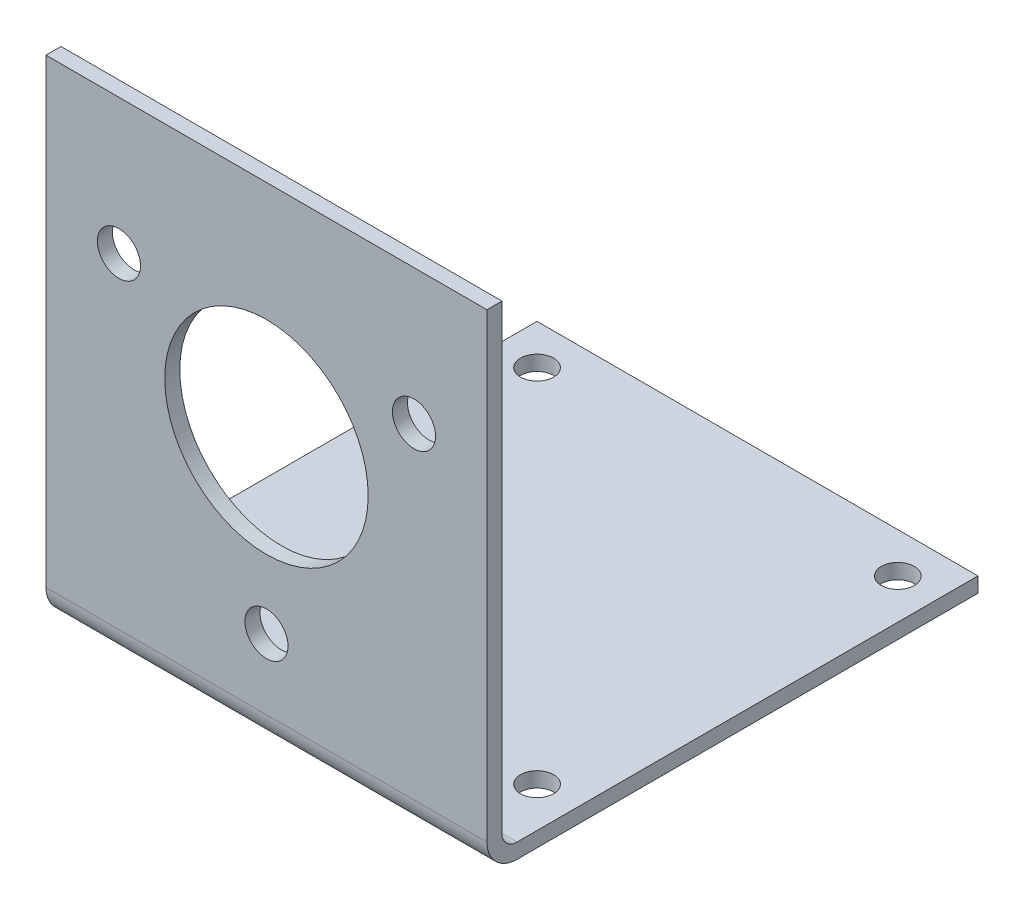
ISO-10303-21;
HEADER;
FILE_DESCRIPTION(('STEP AP214'),'2;1');
FILE_NAME('part.step','',(''),(''),'','','');
FILE_SCHEMA(('AUTOMOTIVE_DESIGN { 1 0 10303 214 1 1 1 1 }'));
ENDSEC;
DATA;
#1=APPLICATION_CONTEXT('core data for automotive mechanical design processes');
#2=APPLICATION_PROTOCOL_DEFINITION('international standard','automotive_design',2000,#1);
#3=PRODUCT_CONTEXT('',#1,'mechanical');
#4=PRODUCT('Part','Part','',(#3));
#5=PRODUCT_RELATED_PRODUCT_CATEGORY('part','',(#4));
#6=PRODUCT_DEFINITION_FORMATION('','',#4);
#7=PRODUCT_DEFINITION_CONTEXT('part definition',#1,'design');
#8=PRODUCT_DEFINITION('design','',#6,#7);
#9=PRODUCT_DEFINITION_SHAPE('','',#8);
#10=(LENGTH_UNIT() NAMED_UNIT(*) SI_UNIT(.MILLI.,.METRE.));
#11=(NAMED_UNIT(*) PLANE_ANGLE_UNIT() SI_UNIT($,.RADIAN.));
#12=(NAMED_UNIT(*) SI_UNIT($,.STERADIAN.) SOLID_ANGLE_UNIT());
#13=UNCERTAINTY_MEASURE_WITH_UNIT(LENGTH_MEASURE(1.E-05),#10,'distance_accuracy_value','');
#14=(GEOMETRIC_REPRESENTATION_CONTEXT(3) GLOBAL_UNCERTAINTY_ASSIGNED_CONTEXT((#13)) GLOBAL_UNIT_ASSIGNED_CONTEXT((#10,
#11,#12)) REPRESENTATION_CONTEXT('',''));
#15=CARTESIAN_POINT('',(0.,0.,0.));
#16=DIRECTION('',(0.,0.,1.));
#17=DIRECTION('',(1.,0.,0.));
#18=AXIS2_PLACEMENT_3D('',#15,#16,#17);
#19=CARTESIAN_POINT('',(-22.,24.3035399670615,-1.5));
#20=DIRECTION('',(0.,0.,-1.));
#21=DIRECTION('',(0.,1.,0.));
#22=AXIS2_PLACEMENT_3D('',#19,#20,#21);
#23=PLANE('',#22);
#24=CARTESIAN_POINT('',(-22.,9.99999999999999,-1.5));
#25=DIRECTION('',(0.,0.,1.));
#26=DIRECTION('',(0.,-1.,0.));
#27=AXIS2_PLACEMENT_3D('',#24,#25,#26);
#28=CIRCLE('',#27,2.15);
#29=CARTESIAN_POINT('',(-22.,7.85,-1.5));
#30=VERTEX_POINT('',#29);
#31=EDGE_CURVE('E98',#30,#30,#28,.T.);
#32=ORIENTED_EDGE('',*,*,#31,.T.);
#33=EDGE_LOOP('',(#32));
#34=FACE_BOUND('',#33,.T.);
#35=CARTESIAN_POINT('',(-22.,27.,-1.5));
#36=DIRECTION('',(0.,0.,-1.));
#37=DIRECTION('',(-1.,0.,0.));
#38=AXIS2_PLACEMENT_3D('',#35,#36,#37);
#39=CIRCLE('',#38,10.15);
#40=CARTESIAN_POINT('',(-32.15,27.,-1.5));
#41=VERTEX_POINT('',#40);
#42=EDGE_CURVE('E158',#41,#41,#39,.F.);
#43=ORIENTED_EDGE('',*,*,#42,.T.);
#44=EDGE_LOOP('',(#43));
#45=FACE_BOUND('',#44,.T.);
#46=CARTESIAN_POINT('',(-36.7224318643355,35.5,-1.5));
#47=DIRECTION('',(0.,0.,1.));
#48=DIRECTION('',(1.,0.,0.));
#49=AXIS2_PLACEMENT_3D('',#46,#47,#48);
#50=CIRCLE('',#49,2.15);
#51=CARTESIAN_POINT('',(-34.5724318643355,35.5,-1.5));
#52=VERTEX_POINT('',#51);
#53=EDGE_CURVE('E160',#52,#52,#50,.T.);
#54=ORIENTED_EDGE('',*,*,#53,.T.);
#55=EDGE_LOOP('',(#54));
#56=FACE_BOUND('',#55,.T.);
#57=CARTESIAN_POINT('',(-7.27756813566455,35.5,-1.5));
#58=DIRECTION('',(0.,0.,1.));
#59=DIRECTION('',(0.,-1.,0.));
#60=AXIS2_PLACEMENT_3D('',#57,#58,#59);
#61=CIRCLE('',#60,2.15);
#62=CARTESIAN_POINT('',(-7.27756813566455,33.35,-1.5));
#63=VERTEX_POINT('',#62);
#64=EDGE_CURVE('E20',#63,#63,#61,.T.);
#65=ORIENTED_EDGE('',*,*,#64,.T.);
#66=EDGE_LOOP('',(#65));
#67=FACE_BOUND('',#66,.T.);
#68=DIRECTION('',(1.,0.,0.));
#69=VECTOR('',#68,1.);
#70=CARTESIAN_POINT('',(0.,49.,-1.5));
#71=LINE('',#70,#69);
#72=CARTESIAN_POINT('',(0.,49.,-1.5));
#73=VERTEX_POINT('',#72);
#74=CARTESIAN_POINT('',(-44.,49.,-1.5));
#75=VERTEX_POINT('',#74);
#76=EDGE_CURVE('E104',#73,#75,#71,.F.);
#77=ORIENTED_EDGE('',*,*,#76,.F.);
#78=DIRECTION('',(0.,1.,0.));
#79=VECTOR('',#78,1.);
#80=CARTESIAN_POINT('',(0.,3.,-1.5));
#81=LINE('',#80,#79);
#82=CARTESIAN_POINT('',(0.,3.,-1.5));
#83=VERTEX_POINT('',#82);
#84=EDGE_CURVE('E95',#83,#73,#81,.T.);
#85=ORIENTED_EDGE('',*,*,#84,.F.);
#86=DIRECTION('',(-1.,0.,0.));
#87=VECTOR('',#86,1.);
#88=CARTESIAN_POINT('',(-22.,3.,-1.5));
#89=LINE('',#88,#87);
#90=CARTESIAN_POINT('',(-44.,3.,-1.5));
#91=VERTEX_POINT('',#90);
#92=EDGE_CURVE('E83',#83,#91,#89,.T.);
#93=ORIENTED_EDGE('',*,*,#92,.T.);
#94=DIRECTION('',(0.,-1.,0.));
#95=VECTOR('',#94,1.);
#96=CARTESIAN_POINT('',(-44.,3.,-1.5));
#97=LINE('',#96,#95);
#98=EDGE_CURVE('E92',#75,#91,#97,.T.);
#99=ORIENTED_EDGE('',*,*,#98,.F.);
#100=EDGE_LOOP('',(#77,#85,#93,#99));
#101=FACE_BOUND('',#100,.T.);
#102=ADVANCED_FACE('F17',(#34,#45,#56,#67,#101),#23,.T.);
#103=CARTESIAN_POINT('',(0.,49.,0.));
#104=DIRECTION('',(0.,1.,0.));
#105=DIRECTION('',(0.,0.,1.));
#106=AXIS2_PLACEMENT_3D('',#103,#104,#105);
#107=PLANE('',#106);
#108=DIRECTION('',(1.,0.,0.));
#109=VECTOR('',#108,1.);
#110=CARTESIAN_POINT('',(-22.,49.,0.));
#111=LINE('',#110,#109);
#112=CARTESIAN_POINT('',(-44.,49.,0.));
#113=VERTEX_POINT('',#112);
#114=CARTESIAN_POINT('',(0.,49.,0.));
#115=VERTEX_POINT('',#114);
#116=EDGE_CURVE('E177',#113,#115,#111,.T.);
#117=ORIENTED_EDGE('',*,*,#116,.T.);
#118=DIRECTION('',(0.,0.,1.));
#119=VECTOR('',#118,1.);
#120=CARTESIAN_POINT('',(0.,49.,0.));
#121=LINE('',#120,#119);
#122=EDGE_CURVE('E165',#73,#115,#121,.T.);
#123=ORIENTED_EDGE('',*,*,#122,.F.);
#124=ORIENTED_EDGE('',*,*,#76,.T.);
#125=DIRECTION('',(0.,0.,1.));
#126=VECTOR('',#125,1.);
#127=CARTESIAN_POINT('',(-44.,49.,0.));
#128=LINE('',#127,#126);
#129=EDGE_CURVE('E102',#75,#113,#128,.T.);
#130=ORIENTED_EDGE('',*,*,#129,.T.);
#131=EDGE_LOOP('',(#117,#123,#124,#130));
#132=FACE_BOUND('',#131,.T.);
#133=ADVANCED_FACE('F187',(#132),#107,.T.);
#134=CARTESIAN_POINT('',(-7.27756813566455,35.5,-82.0853214649246));
#135=DIRECTION('',(0.,0.,1.));
#136=DIRECTION('',(0.,-1.,0.));
#137=AXIS2_PLACEMENT_3D('',#134,#135,#136);
#138=CYLINDRICAL_SURFACE('',#137,2.15);
#139=CARTESIAN_POINT('',(-7.27756813566455,35.5,0.));
#140=DIRECTION('',(0.,0.,1.));
#141=DIRECTION('',(0.,-1.,0.));
#142=AXIS2_PLACEMENT_3D('',#139,#140,#141);
#143=CIRCLE('',#142,2.15);
#144=CARTESIAN_POINT('',(-7.27756813566455,33.35,0.));
#145=VERTEX_POINT('',#144);
#146=EDGE_CURVE('E152',#145,#145,#143,.T.);
#147=ORIENTED_EDGE('',*,*,#146,.T.);
#148=EDGE_LOOP('',(#147));
#149=FACE_BOUND('',#148,.T.);
#150=ORIENTED_EDGE('',*,*,#64,.F.);
#151=EDGE_LOOP('',(#150));
#152=FACE_BOUND('',#151,.T.);
#153=ADVANCED_FACE('F372',(#149,#152),#138,.F.);
#154=CARTESIAN_POINT('',(-36.7224318643355,35.5,-82.0853214649246));
#155=DIRECTION('',(0.,0.,1.));
#156=DIRECTION('',(1.,0.,0.));
#157=AXIS2_PLACEMENT_3D('',#154,#155,#156);
#158=CYLINDRICAL_SURFACE('',#157,2.15);
#159=CARTESIAN_POINT('',(-36.7224318643355,35.5,0.));
#160=DIRECTION('',(0.,0.,1.));
#161=DIRECTION('',(1.,0.,0.));
#162=AXIS2_PLACEMENT_3D('',#159,#160,#161);
#163=CIRCLE('',#162,2.15);
#164=CARTESIAN_POINT('',(-34.5724318643355,35.5,0.));
#165=VERTEX_POINT('',#164);
#166=EDGE_CURVE('E149',#165,#165,#163,.T.);
#167=ORIENTED_EDGE('',*,*,#166,.T.);
#168=EDGE_LOOP('',(#167));
#169=FACE_BOUND('',#168,.T.);
#170=ORIENTED_EDGE('',*,*,#53,.F.);
#171=EDGE_LOOP('',(#170));
#172=FACE_BOUND('',#171,.T.);
#173=ADVANCED_FACE('F363',(#169,#172),#158,.F.);
#174=CARTESIAN_POINT('',(-22.,27.,0.));
#175=DIRECTION('',(0.,0.,-1.));
#176=DIRECTION('',(-1.,0.,0.));
#177=AXIS2_PLACEMENT_3D('',#174,#175,#176);
#178=CYLINDRICAL_SURFACE('',#177,10.15);
#179=CARTESIAN_POINT('',(-22.,27.,0.));
#180=DIRECTION('',(0.,0.,-1.));
#181=DIRECTION('',(-1.,0.,0.));
#182=AXIS2_PLACEMENT_3D('',#179,#180,#181);
#183=CIRCLE('',#182,10.15);
#184=CARTESIAN_POINT('',(-32.15,27.,0.));
#185=VERTEX_POINT('',#184);
#186=EDGE_CURVE('E146',#185,#185,#183,.F.);
#187=ORIENTED_EDGE('',*,*,#186,.T.);
#188=EDGE_LOOP('',(#187));
#189=FACE_BOUND('',#188,.T.);
#190=ORIENTED_EDGE('',*,*,#42,.F.);
#191=EDGE_LOOP('',(#190));
#192=FACE_BOUND('',#191,.T.);
#193=ADVANCED_FACE('F354',(#189,#192),#178,.F.);
#194=CARTESIAN_POINT('',(-22.,10.,-82.0853214649246));
#195=DIRECTION('',(0.,0.,1.));
#196=DIRECTION('',(0.,-1.,0.));
#197=AXIS2_PLACEMENT_3D('',#194,#195,#196);
#198=CYLINDRICAL_SURFACE('',#197,2.15);
#199=CARTESIAN_POINT('',(-22.,9.99999999999999,0.));
#200=DIRECTION('',(0.,0.,1.));
#201=DIRECTION('',(0.,-1.,0.));
#202=AXIS2_PLACEMENT_3D('',#199,#200,#201);
#203=CIRCLE('',#202,2.15);
#204=CARTESIAN_POINT('',(-22.,7.85,0.));
#205=VERTEX_POINT('',#204);
#206=EDGE_CURVE('E89',#205,#205,#203,.T.);
#207=ORIENTED_EDGE('',*,*,#206,.T.);
#208=EDGE_LOOP('',(#207));
#209=FACE_BOUND('',#208,.T.);
#210=ORIENTED_EDGE('',*,*,#31,.F.);
#211=EDGE_LOOP('',(#210));
#212=FACE_BOUND('',#211,.T.);
#213=ADVANCED_FACE('F346',(#209,#212),#198,.F.);
#214=CARTESIAN_POINT('',(-22.,3.,-3.));
#215=DIRECTION('',(-1.,0.,0.));
#216=DIRECTION('',(0.,-1.,0.));
#217=AXIS2_PLACEMENT_3D('',#214,#215,#216);
#218=CYLINDRICAL_SURFACE('',#217,1.5);
#219=CARTESIAN_POINT('',(0.,3.,-3.));
#220=DIRECTION('',(-1.,0.,0.));
#221=DIRECTION('',(0.,-1.,0.));
#222=AXIS2_PLACEMENT_3D('',#219,#220,#221);
#223=CIRCLE('',#222,1.5);
#224=CARTESIAN_POINT('',(0.,1.5,-3.));
#225=VERTEX_POINT('',#224);
#226=EDGE_CURVE('E88',#225,#83,#223,.T.);
#227=ORIENTED_EDGE('',*,*,#226,.F.);
#228=DIRECTION('',(1.,0.,0.));
#229=VECTOR('',#228,1.);
#230=CARTESIAN_POINT('',(-22.,1.5,-3.));
#231=LINE('',#230,#229);
#232=CARTESIAN_POINT('',(-44.,1.5,-3.));
#233=VERTEX_POINT('',#232);
#234=EDGE_CURVE('E85',#233,#225,#231,.T.);
#235=ORIENTED_EDGE('',*,*,#234,.F.);
#236=CARTESIAN_POINT('',(-44.,3.,-3.));
#237=DIRECTION('',(-1.,0.,0.));
#238=DIRECTION('',(0.,-1.,0.));
#239=AXIS2_PLACEMENT_3D('',#236,#237,#238);
#240=CIRCLE('',#239,1.5);
#241=EDGE_CURVE('E80',#91,#233,#240,.F.);
#242=ORIENTED_EDGE('',*,*,#241,.F.);
#243=ORIENTED_EDGE('',*,*,#92,.F.);
#244=EDGE_LOOP('',(#227,#235,#242,#243));
#245=FACE_BOUND('',#244,.T.);
#246=ADVANCED_FACE('F82',(#245),#218,.F.);
#247=CARTESIAN_POINT('',(-22.,24.3035399670615,0.));
#248=DIRECTION('',(0.,0.,-1.));
#249=DIRECTION('',(0.,1.,0.));
#250=AXIS2_PLACEMENT_3D('',#247,#248,#249);
#251=PLANE('',#250);
#252=ORIENTED_EDGE('',*,*,#206,.F.);
#253=EDGE_LOOP('',(#252));
#254=FACE_BOUND('',#253,.T.);
#255=ORIENTED_EDGE('',*,*,#186,.F.);
#256=EDGE_LOOP('',(#255));
#257=FACE_BOUND('',#256,.T.);
#258=ORIENTED_EDGE('',*,*,#166,.F.);
#259=EDGE_LOOP('',(#258));
#260=FACE_BOUND('',#259,.T.);
#261=ORIENTED_EDGE('',*,*,#146,.F.);
#262=EDGE_LOOP('',(#261));
#263=FACE_BOUND('',#262,.T.);
#264=DIRECTION('',(0.,1.,0.));
#265=VECTOR('',#264,1.);
#266=CARTESIAN_POINT('',(0.,24.3035399670615,0.));
#267=LINE('',#266,#265);
#268=CARTESIAN_POINT('',(0.,3.,0.));
#269=VERTEX_POINT('',#268);
#270=EDGE_CURVE('E155',#115,#269,#267,.F.);
#271=ORIENTED_EDGE('',*,*,#270,.F.);
#272=ORIENTED_EDGE('',*,*,#116,.F.);
#273=DIRECTION('',(0.,1.,0.));
#274=VECTOR('',#273,1.);
#275=CARTESIAN_POINT('',(-44.,24.3035399670615,0.));
#276=LINE('',#275,#274);
#277=CARTESIAN_POINT('',(-44.,3.,0.));
#278=VERTEX_POINT('',#277);
#279=EDGE_CURVE('E97',#278,#113,#276,.T.);
#280=ORIENTED_EDGE('',*,*,#279,.F.);
#281=DIRECTION('',(-1.,0.,0.));
#282=VECTOR('',#281,1.);
#283=CARTESIAN_POINT('',(-22.,3.,0.));
#284=LINE('',#283,#282);
#285=EDGE_CURVE('E142',#269,#278,#284,.T.);
#286=ORIENTED_EDGE('',*,*,#285,.F.);
#287=EDGE_LOOP('',(#271,#272,#280,#286));
#288=FACE_BOUND('',#287,.T.);
#289=ADVANCED_FACE('F189',(#254,#257,#260,#263,#288),#251,.F.);
#290=CARTESIAN_POINT('',(-22.,1.5,-24.5));
#291=DIRECTION('',(0.,1.,0.));
#292=DIRECTION('',(0.,0.,1.));
#293=AXIS2_PLACEMENT_3D('',#290,#291,#292);
#294=PLANE('',#293);
#295=CARTESIAN_POINT('',(-40.,1.5,-45.));
#296=DIRECTION('',(0.,-1.,0.));
#297=DIRECTION('',(1.,0.,0.));
#298=AXIS2_PLACEMENT_3D('',#295,#296,#297);
#299=CIRCLE('',#298,1.65);
#300=CARTESIAN_POINT('',(-38.35,1.5,-45.));
#301=VERTEX_POINT('',#300);
#302=EDGE_CURVE('E122',#301,#301,#299,.T.);
#303=ORIENTED_EDGE('',*,*,#302,.T.);
#304=EDGE_LOOP('',(#303));
#305=FACE_BOUND('',#304,.T.);
#306=CARTESIAN_POINT('',(-4.,1.5,-45.));
#307=DIRECTION('',(0.,-1.,0.));
#308=DIRECTION('',(1.,0.,0.));
#309=AXIS2_PLACEMENT_3D('',#306,#307,#308);
#310=CIRCLE('',#309,1.65);
#311=CARTESIAN_POINT('',(-2.35,1.5,-45.));
#312=VERTEX_POINT('',#311);
#313=EDGE_CURVE('E126',#312,#312,#310,.T.);
#314=ORIENTED_EDGE('',*,*,#313,.T.);
#315=EDGE_LOOP('',(#314));
#316=FACE_BOUND('',#315,.T.);
#317=CARTESIAN_POINT('',(-40.,1.5,-8.99999999999998));
#318=DIRECTION('',(0.,-1.,0.));
#319=DIRECTION('',(1.,0.,0.));
#320=AXIS2_PLACEMENT_3D('',#317,#318,#319);
#321=CIRCLE('',#320,1.65);
#322=CARTESIAN_POINT('',(-38.35,1.5,-8.99999999999998));
#323=VERTEX_POINT('',#322);
#324=EDGE_CURVE('E129',#323,#323,#321,.T.);
#325=ORIENTED_EDGE('',*,*,#324,.T.);
#326=EDGE_LOOP('',(#325));
#327=FACE_BOUND('',#326,.T.);
#328=CARTESIAN_POINT('',(-4.00000000000001,1.5,-8.99999999999998));
#329=DIRECTION('',(0.,-1.,0.));
#330=DIRECTION('',(1.,0.,0.));
#331=AXIS2_PLACEMENT_3D('',#328,#329,#330);
#332=CIRCLE('',#331,1.65);
#333=CARTESIAN_POINT('',(-2.35000000000001,1.5,-8.99999999999998));
#334=VERTEX_POINT('',#333);
#335=EDGE_CURVE('E132',#334,#334,#332,.T.);
#336=ORIENTED_EDGE('',*,*,#335,.T.);
#337=EDGE_LOOP('',(#336));
#338=FACE_BOUND('',#337,.T.);
#339=DIRECTION('',(-1.,0.,0.));
#340=VECTOR('',#339,1.);
#341=CARTESIAN_POINT('',(0.,1.5,-49.));
#342=LINE('',#341,#340);
#343=CARTESIAN_POINT('',(-44.,1.5,-49.));
#344=VERTEX_POINT('',#343);
#345=CARTESIAN_POINT('',(0.,1.5,-49.));
#346=VERTEX_POINT('',#345);
#347=EDGE_CURVE('E206',#344,#346,#342,.F.);
#348=ORIENTED_EDGE('',*,*,#347,.F.);
#349=DIRECTION('',(0.,0.,1.));
#350=VECTOR('',#349,1.);
#351=CARTESIAN_POINT('',(-44.,1.5,-49.));
#352=LINE('',#351,#350);
#353=EDGE_CURVE('E139',#233,#344,#352,.F.);
#354=ORIENTED_EDGE('',*,*,#353,.F.);
#355=ORIENTED_EDGE('',*,*,#234,.T.);
#356=DIRECTION('',(0.,0.,-1.));
#357=VECTOR('',#356,1.);
#358=CARTESIAN_POINT('',(0.,1.5,0.));
#359=LINE('',#358,#357);
#360=EDGE_CURVE('E135',#346,#225,#359,.F.);
#361=ORIENTED_EDGE('',*,*,#360,.F.);
#362=EDGE_LOOP('',(#348,#354,#355,#361));
#363=FACE_BOUND('',#362,.T.);
#364=ADVANCED_FACE('F231',(#305,#316,#327,#338,#363),#294,.T.);
#365=CARTESIAN_POINT('',(-22.,3.,-3.));
#366=DIRECTION('',(-1.,0.,0.));
#367=DIRECTION('',(0.,-1.,0.));
#368=AXIS2_PLACEMENT_3D('',#365,#366,#367);
#369=CYLINDRICAL_SURFACE('',#368,3.);
#370=DIRECTION('',(1.,0.,0.));
#371=VECTOR('',#370,1.);
#372=CARTESIAN_POINT('',(-22.,0.,-3.));
#373=LINE('',#372,#371);
#374=CARTESIAN_POINT('',(0.,0.,-3.));
#375=VERTEX_POINT('',#374);
#376=CARTESIAN_POINT('',(-44.,0.,-3.));
#377=VERTEX_POINT('',#376);
#378=EDGE_CURVE('E125',#375,#377,#373,.F.);
#379=ORIENTED_EDGE('',*,*,#378,.F.);
#380=CARTESIAN_POINT('',(0.,3.,-3.));
#381=DIRECTION('',(-1.,0.,0.));
#382=DIRECTION('',(0.,-1.,0.));
#383=AXIS2_PLACEMENT_3D('',#380,#381,#382);
#384=CIRCLE('',#383,3.);
#385=EDGE_CURVE('E136',#375,#269,#384,.T.);
#386=ORIENTED_EDGE('',*,*,#385,.T.);
#387=ORIENTED_EDGE('',*,*,#285,.T.);
#388=CARTESIAN_POINT('',(-44.,3.,-3.));
#389=DIRECTION('',(-1.,0.,0.));
#390=DIRECTION('',(0.,-1.,0.));
#391=AXIS2_PLACEMENT_3D('',#388,#389,#390);
#392=CIRCLE('',#391,3.);
#393=EDGE_CURVE('E140',#278,#377,#392,.F.);
#394=ORIENTED_EDGE('',*,*,#393,.T.);
#395=EDGE_LOOP('',(#379,#386,#387,#394));
#396=FACE_BOUND('',#395,.T.);
#397=ADVANCED_FACE('F220',(#396),#369,.T.);
#398=CARTESIAN_POINT('',(-44.,0.,-49.));
#399=DIRECTION('',(-1.,0.,0.));
#400=DIRECTION('',(0.,0.,1.));
#401=AXIS2_PLACEMENT_3D('',#398,#399,#400);
#402=PLANE('',#401);
#403=DIRECTION('',(0.,1.,0.));
#404=VECTOR('',#403,1.);
#405=CARTESIAN_POINT('',(-44.,0.,-49.));
#406=LINE('',#405,#404);
#407=CARTESIAN_POINT('',(-44.,0.,-49.));
#408=VERTEX_POINT('',#407);
#409=EDGE_CURVE('E208',#408,#344,#406,.T.);
#410=ORIENTED_EDGE('',*,*,#409,.F.);
#411=DIRECTION('',(0.,0.,1.));
#412=VECTOR('',#411,1.);
#413=CARTESIAN_POINT('',(-44.,0.,-24.5));
#414=LINE('',#413,#412);
#415=EDGE_CURVE('E196',#377,#408,#414,.F.);
#416=ORIENTED_EDGE('',*,*,#415,.F.);
#417=ORIENTED_EDGE('',*,*,#393,.F.);
#418=ORIENTED_EDGE('',*,*,#279,.T.);
#419=ORIENTED_EDGE('',*,*,#129,.F.);
#420=ORIENTED_EDGE('',*,*,#98,.T.);
#421=ORIENTED_EDGE('',*,*,#241,.T.);
#422=ORIENTED_EDGE('',*,*,#353,.T.);
#423=EDGE_LOOP('',(#410,#416,#417,#418,#419,#420,#421,#422));
#424=FACE_BOUND('',#423,.T.);
#425=ADVANCED_FACE('F100',(#424),#402,.T.);
#426=CARTESIAN_POINT('',(0.,0.,-49.));
#427=DIRECTION('',(0.,0.,-1.));
#428=DIRECTION('',(-1.,0.,0.));
#429=AXIS2_PLACEMENT_3D('',#426,#427,#428);
#430=PLANE('',#429);
#431=ORIENTED_EDGE('',*,*,#347,.T.);
#432=DIRECTION('',(0.,1.,0.));
#433=VECTOR('',#432,1.);
#434=CARTESIAN_POINT('',(0.,0.,-49.));
#435=LINE('',#434,#433);
#436=CARTESIAN_POINT('',(0.,0.,-49.));
#437=VERTEX_POINT('',#436);
#438=EDGE_CURVE('E35',#437,#346,#435,.T.);
#439=ORIENTED_EDGE('',*,*,#438,.F.);
#440=DIRECTION('',(1.,0.,0.));
#441=VECTOR('',#440,1.);
#442=CARTESIAN_POINT('',(-22.,0.,-49.));
#443=LINE('',#442,#441);
#444=EDGE_CURVE('E211',#408,#437,#443,.T.);
#445=ORIENTED_EDGE('',*,*,#444,.F.);
#446=ORIENTED_EDGE('',*,*,#409,.T.);
#447=EDGE_LOOP('',(#431,#439,#445,#446));
#448=FACE_BOUND('',#447,.T.);
#449=ADVANCED_FACE('F227',(#448),#430,.T.);
#450=CARTESIAN_POINT('',(0.,0.,0.));
#451=DIRECTION('',(1.,0.,0.));
#452=DIRECTION('',(0.,0.,-1.));
#453=AXIS2_PLACEMENT_3D('',#450,#451,#452);
#454=PLANE('',#453);
#455=ORIENTED_EDGE('',*,*,#438,.T.);
#456=ORIENTED_EDGE('',*,*,#360,.T.);
#457=ORIENTED_EDGE('',*,*,#226,.T.);
#458=ORIENTED_EDGE('',*,*,#84,.T.);
#459=ORIENTED_EDGE('',*,*,#122,.T.);
#460=ORIENTED_EDGE('',*,*,#270,.T.);
#461=ORIENTED_EDGE('',*,*,#385,.F.);
#462=DIRECTION('',(0.,0.,1.));
#463=VECTOR('',#462,1.);
#464=CARTESIAN_POINT('',(0.,0.,-24.5));
#465=LINE('',#464,#463);
#466=EDGE_CURVE('E121',#437,#375,#465,.T.);
#467=ORIENTED_EDGE('',*,*,#466,.F.);
#468=EDGE_LOOP('',(#455,#456,#457,#458,#459,#460,#461,#467));
#469=FACE_BOUND('',#468,.T.);
#470=ADVANCED_FACE('F222',(#469),#454,.T.);
#471=CARTESIAN_POINT('',(-4.00000000000001,82.0853214649246,-8.99999999999998));
#472=DIRECTION('',(0.,-1.,0.));
#473=DIRECTION('',(1.,0.,0.));
#474=AXIS2_PLACEMENT_3D('',#471,#472,#473);
#475=CYLINDRICAL_SURFACE('',#474,1.65);
#476=CARTESIAN_POINT('',(-4.00000000000001,0.,-8.99999999999998));
#477=DIRECTION('',(0.,-1.,0.));
#478=DIRECTION('',(1.,0.,0.));
#479=AXIS2_PLACEMENT_3D('',#476,#477,#478);
#480=CIRCLE('',#479,1.65);
#481=CARTESIAN_POINT('',(-2.35000000000001,0.,-8.99999999999998));
#482=VERTEX_POINT('',#481);
#483=EDGE_CURVE('E118',#482,#482,#480,.F.);
#484=ORIENTED_EDGE('',*,*,#483,.F.);
#485=EDGE_LOOP('',(#484));
#486=FACE_BOUND('',#485,.T.);
#487=ORIENTED_EDGE('',*,*,#335,.F.);
#488=EDGE_LOOP('',(#487));
#489=FACE_BOUND('',#488,.T.);
#490=ADVANCED_FACE('F262',(#486,#489),#475,.F.);
#491=CARTESIAN_POINT('',(-40.,82.0853214649246,-8.99999999999998));
#492=DIRECTION('',(0.,-1.,0.));
#493=DIRECTION('',(1.,0.,0.));
#494=AXIS2_PLACEMENT_3D('',#491,#492,#493);
#495=CYLINDRICAL_SURFACE('',#494,1.65);
#496=CARTESIAN_POINT('',(-40.,0.,-8.99999999999998));
#497=DIRECTION('',(0.,-1.,0.));
#498=DIRECTION('',(1.,0.,0.));
#499=AXIS2_PLACEMENT_3D('',#496,#497,#498);
#500=CIRCLE('',#499,1.65);
#501=CARTESIAN_POINT('',(-38.35,0.,-8.99999999999998));
#502=VERTEX_POINT('',#501);
#503=EDGE_CURVE('E115',#502,#502,#500,.F.);
#504=ORIENTED_EDGE('',*,*,#503,.F.);
#505=EDGE_LOOP('',(#504));
#506=FACE_BOUND('',#505,.T.);
#507=ORIENTED_EDGE('',*,*,#324,.F.);
#508=EDGE_LOOP('',(#507));
#509=FACE_BOUND('',#508,.T.);
#510=ADVANCED_FACE('F258',(#506,#509),#495,.F.);
#511=CARTESIAN_POINT('',(-4.,82.0853214649246,-45.));
#512=DIRECTION('',(0.,-1.,0.));
#513=DIRECTION('',(1.,0.,0.));
#514=AXIS2_PLACEMENT_3D('',#511,#512,#513);
#515=CYLINDRICAL_SURFACE('',#514,1.65);
#516=CARTESIAN_POINT('',(-4.,0.,-45.));
#517=DIRECTION('',(0.,-1.,0.));
#518=DIRECTION('',(1.,0.,0.));
#519=AXIS2_PLACEMENT_3D('',#516,#517,#518);
#520=CIRCLE('',#519,1.65);
#521=CARTESIAN_POINT('',(-2.35,0.,-45.));
#522=VERTEX_POINT('',#521);
#523=EDGE_CURVE('E26',#522,#522,#520,.F.);
#524=ORIENTED_EDGE('',*,*,#523,.F.);
#525=EDGE_LOOP('',(#524));
#526=FACE_BOUND('',#525,.T.);
#527=ORIENTED_EDGE('',*,*,#313,.F.);
#528=EDGE_LOOP('',(#527));
#529=FACE_BOUND('',#528,.T.);
#530=ADVANCED_FACE('F251',(#526,#529),#515,.F.);
#531=CARTESIAN_POINT('',(-40.,82.0853214649246,-45.));
#532=DIRECTION('',(0.,-1.,0.));
#533=DIRECTION('',(1.,0.,0.));
#534=AXIS2_PLACEMENT_3D('',#531,#532,#533);
#535=CYLINDRICAL_SURFACE('',#534,1.65);
#536=CARTESIAN_POINT('',(-40.,0.,-45.));
#537=DIRECTION('',(0.,-1.,0.));
#538=DIRECTION('',(1.,0.,0.));
#539=AXIS2_PLACEMENT_3D('',#536,#537,#538);
#540=CIRCLE('',#539,1.65);
#541=CARTESIAN_POINT('',(-38.35,0.,-45.));
#542=VERTEX_POINT('',#541);
#543=EDGE_CURVE('E11',#542,#542,#540,.F.);
#544=ORIENTED_EDGE('',*,*,#543,.F.);
#545=EDGE_LOOP('',(#544));
#546=FACE_BOUND('',#545,.T.);
#547=ORIENTED_EDGE('',*,*,#302,.F.);
#548=EDGE_LOOP('',(#547));
#549=FACE_BOUND('',#548,.T.);
#550=ADVANCED_FACE('F245',(#546,#549),#535,.F.);
#551=CARTESIAN_POINT('',(-22.,0.,-24.5));
#552=DIRECTION('',(0.,-1.,0.));
#553=DIRECTION('',(1.,0.,0.));
#554=AXIS2_PLACEMENT_3D('',#551,#552,#553);
#555=PLANE('',#554);
#556=ORIENTED_EDGE('',*,*,#543,.T.);
#557=EDGE_LOOP('',(#556));
#558=FACE_BOUND('',#557,.T.);
#559=ORIENTED_EDGE('',*,*,#523,.T.);
#560=EDGE_LOOP('',(#559));
#561=FACE_BOUND('',#560,.T.);
#562=ORIENTED_EDGE('',*,*,#503,.T.);
#563=EDGE_LOOP('',(#562));
#564=FACE_BOUND('',#563,.T.);
#565=ORIENTED_EDGE('',*,*,#483,.T.);
#566=EDGE_LOOP('',(#565));
#567=FACE_BOUND('',#566,.T.);
#568=ORIENTED_EDGE('',*,*,#444,.T.);
#569=ORIENTED_EDGE('',*,*,#466,.T.);
#570=ORIENTED_EDGE('',*,*,#378,.T.);
#571=ORIENTED_EDGE('',*,*,#415,.T.);
#572=EDGE_LOOP('',(#568,#569,#570,#571));
#573=FACE_BOUND('',#572,.T.);
#574=ADVANCED_FACE('F226',(#558,#561,#564,#567,#573),#555,.T.);
#575=CLOSED_SHELL('',(#102,#133,#153,#173,#193,#213,#246,#289,#364,#397,#425,#449,#470,#490,
#510,#530,#550,#574));
#576=MANIFOLD_SOLID_BREP('B1',#575);
#577=ADVANCED_BREP_SHAPE_REPRESENTATION('',(#18,#576),#14);
#578=SHAPE_DEFINITION_REPRESENTATION(#9,#577);
ENDSEC;
END-ISO-10303-21;
